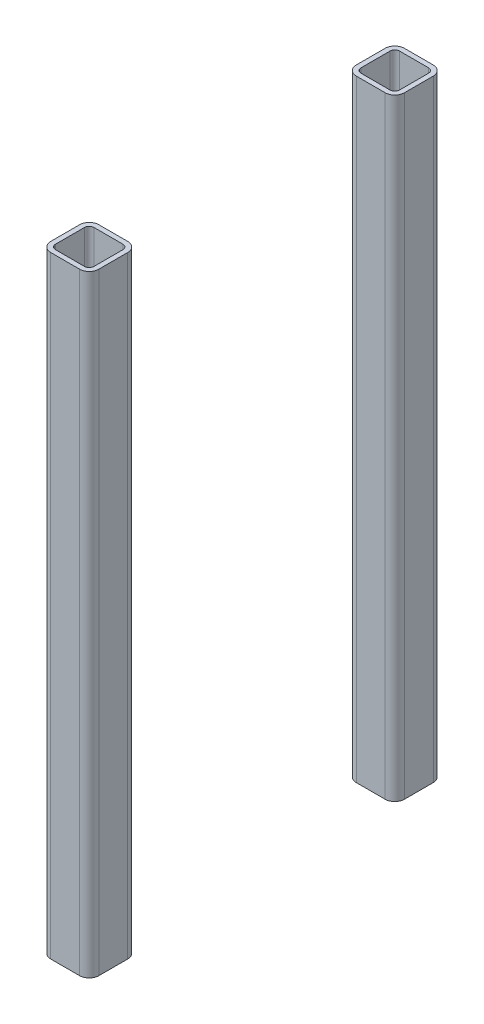
ISO-10303-21;
HEADER;
FILE_DESCRIPTION(('STEP AP214'),'2;1');
FILE_NAME('part.step','',(''),(''),'','','');
FILE_SCHEMA(('AUTOMOTIVE_DESIGN { 1 0 10303 214 1 1 1 1 }'));
ENDSEC;
DATA;
#1=APPLICATION_CONTEXT('core data for automotive mechanical design processes');
#2=APPLICATION_PROTOCOL_DEFINITION('international standard','automotive_design',2000,#1);
#3=PRODUCT_CONTEXT('',#1,'mechanical');
#4=PRODUCT('Part','Part','',(#3));
#5=PRODUCT_RELATED_PRODUCT_CATEGORY('part','',(#4));
#6=PRODUCT_DEFINITION_FORMATION('','',#4);
#7=PRODUCT_DEFINITION_CONTEXT('part definition',#1,'design');
#8=PRODUCT_DEFINITION('design','',#6,#7);
#9=PRODUCT_DEFINITION_SHAPE('','',#8);
#10=(LENGTH_UNIT() NAMED_UNIT(*) SI_UNIT(.MILLI.,.METRE.));
#11=(NAMED_UNIT(*) PLANE_ANGLE_UNIT() SI_UNIT($,.RADIAN.));
#12=(NAMED_UNIT(*) SI_UNIT($,.STERADIAN.) SOLID_ANGLE_UNIT());
#13=UNCERTAINTY_MEASURE_WITH_UNIT(LENGTH_MEASURE(1.E-05),#10,'distance_accuracy_value','');
#14=(GEOMETRIC_REPRESENTATION_CONTEXT(3) GLOBAL_UNCERTAINTY_ASSIGNED_CONTEXT((#13)) GLOBAL_UNIT_ASSIGNED_CONTEXT((#10,
#11,#12)) REPRESENTATION_CONTEXT('',''));
#15=CARTESIAN_POINT('',(0.,0.,0.));
#16=DIRECTION('',(0.,0.,1.));
#17=DIRECTION('',(1.,0.,0.));
#18=AXIS2_PLACEMENT_3D('',#15,#16,#17);
#19=CARTESIAN_POINT('',(12.,-508.61622231298,12.));
#20=DIRECTION('',(0.,1.,0.));
#21=DIRECTION('',(0.,0.,1.));
#22=AXIS2_PLACEMENT_3D('',#19,#20,#21);
#23=CYLINDRICAL_SURFACE('',#22,7.99999999999999);
#24=CARTESIAN_POINT('',(12.,-1.11022302462516E-13,12.));
#25=DIRECTION('',(0.,-1.,0.));
#26=DIRECTION('',(0.,0.,-1.));
#27=AXIS2_PLACEMENT_3D('',#24,#25,#26);
#28=CIRCLE('',#27,7.99999999999999);
#29=CARTESIAN_POINT('',(20.,-1.11022302462516E-13,12.));
#30=VERTEX_POINT('',#29);
#31=CARTESIAN_POINT('',(12.,-1.11022302462516E-13,20.));
#32=VERTEX_POINT('',#31);
#33=EDGE_CURVE('E257',#30,#32,#28,.T.);
#34=ORIENTED_EDGE('',*,*,#33,.T.);
#35=DIRECTION('',(0.,1.,0.));
#36=VECTOR('',#35,1.);
#37=CARTESIAN_POINT('',(12.,-508.61622231298,20.));
#38=LINE('',#37,#36);
#39=CARTESIAN_POINT('',(12.,-508.61622231298,20.));
#40=VERTEX_POINT('',#39);
#41=EDGE_CURVE('E13',#40,#32,#38,.T.);
#42=ORIENTED_EDGE('',*,*,#41,.F.);
#43=CARTESIAN_POINT('',(12.,-508.61622231298,12.));
#44=DIRECTION('',(0.,-1.,0.));
#45=DIRECTION('',(0.,0.,-1.));
#46=AXIS2_PLACEMENT_3D('',#43,#44,#45);
#47=CIRCLE('',#46,7.99999999999999);
#48=CARTESIAN_POINT('',(20.,-508.61622231298,12.));
#49=VERTEX_POINT('',#48);
#50=EDGE_CURVE('E349',#49,#40,#47,.T.);
#51=ORIENTED_EDGE('',*,*,#50,.F.);
#52=DIRECTION('',(0.,1.,0.));
#53=VECTOR('',#52,1.);
#54=CARTESIAN_POINT('',(20.,-508.61622231298,12.));
#55=LINE('',#54,#53);
#56=EDGE_CURVE('E272',#49,#30,#55,.T.);
#57=ORIENTED_EDGE('',*,*,#56,.T.);
#58=EDGE_LOOP('',(#34,#42,#51,#57));
#59=FACE_BOUND('',#58,.T.);
#60=ADVANCED_FACE('F83',(#59),#23,.T.);
#61=CARTESIAN_POINT('',(12.,-508.61622231298,20.));
#62=DIRECTION('',(0.,0.,-1.));
#63=DIRECTION('',(-1.,0.,0.));
#64=AXIS2_PLACEMENT_3D('',#61,#62,#63);
#65=PLANE('',#64);
#66=DIRECTION('',(-1.,0.,0.));
#67=VECTOR('',#66,1.);
#68=CARTESIAN_POINT('',(12.,-1.11022302462516E-13,20.));
#69=LINE('',#68,#67);
#70=CARTESIAN_POINT('',(-12.,-1.11022302462516E-13,20.));
#71=VERTEX_POINT('',#70);
#72=EDGE_CURVE('E260',#32,#71,#69,.T.);
#73=ORIENTED_EDGE('',*,*,#72,.T.);
#74=DIRECTION('',(0.,1.,0.));
#75=VECTOR('',#74,1.);
#76=CARTESIAN_POINT('',(-12.,-508.61622231298,20.));
#77=LINE('',#76,#75);
#78=CARTESIAN_POINT('',(-12.,-508.61622231298,20.));
#79=VERTEX_POINT('',#78);
#80=EDGE_CURVE('E94',#79,#71,#77,.T.);
#81=ORIENTED_EDGE('',*,*,#80,.F.);
#82=DIRECTION('',(-1.,0.,0.));
#83=VECTOR('',#82,1.);
#84=CARTESIAN_POINT('',(12.,-508.61622231298,20.));
#85=LINE('',#84,#83);
#86=EDGE_CURVE('E351',#40,#79,#85,.T.);
#87=ORIENTED_EDGE('',*,*,#86,.F.);
#88=ORIENTED_EDGE('',*,*,#41,.T.);
#89=EDGE_LOOP('',(#73,#81,#87,#88));
#90=FACE_BOUND('',#89,.T.);
#91=ADVANCED_FACE('F386',(#90),#65,.F.);
#92=CARTESIAN_POINT('',(-12.,-508.61622231298,12.));
#93=DIRECTION('',(0.,1.,0.));
#94=DIRECTION('',(0.,0.,1.));
#95=AXIS2_PLACEMENT_3D('',#92,#93,#94);
#96=CYLINDRICAL_SURFACE('',#95,7.99999999999999);
#97=CARTESIAN_POINT('',(-12.,-1.11022302462516E-13,12.));
#98=DIRECTION('',(0.,-1.,0.));
#99=DIRECTION('',(0.,0.,-1.));
#100=AXIS2_PLACEMENT_3D('',#97,#98,#99);
#101=CIRCLE('',#100,7.99999999999999);
#102=CARTESIAN_POINT('',(-20.,-1.11022302462516E-13,12.));
#103=VERTEX_POINT('',#102);
#104=EDGE_CURVE('E262',#71,#103,#101,.T.);
#105=ORIENTED_EDGE('',*,*,#104,.T.);
#106=DIRECTION('',(0.,1.,0.));
#107=VECTOR('',#106,1.);
#108=CARTESIAN_POINT('',(-20.,-508.61622231298,12.));
#109=LINE('',#108,#107);
#110=CARTESIAN_POINT('',(-20.,-508.61622231298,12.));
#111=VERTEX_POINT('',#110);
#112=EDGE_CURVE('E283',#111,#103,#109,.T.);
#113=ORIENTED_EDGE('',*,*,#112,.F.);
#114=CARTESIAN_POINT('',(-12.,-508.61622231298,12.));
#115=DIRECTION('',(0.,-1.,0.));
#116=DIRECTION('',(0.,0.,-1.));
#117=AXIS2_PLACEMENT_3D('',#114,#115,#116);
#118=CIRCLE('',#117,7.99999999999999);
#119=EDGE_CURVE('E353',#79,#111,#118,.T.);
#120=ORIENTED_EDGE('',*,*,#119,.F.);
#121=ORIENTED_EDGE('',*,*,#80,.T.);
#122=EDGE_LOOP('',(#105,#113,#120,#121));
#123=FACE_BOUND('',#122,.T.);
#124=ADVANCED_FACE('F391',(#123),#96,.T.);
#125=CARTESIAN_POINT('',(-20.,-508.61622231298,-12.));
#126=DIRECTION('',(1.,0.,0.));
#127=DIRECTION('',(0.,0.,-1.));
#128=AXIS2_PLACEMENT_3D('',#125,#126,#127);
#129=PLANE('',#128);
#130=DIRECTION('',(0.,0.,-1.));
#131=VECTOR('',#130,1.);
#132=CARTESIAN_POINT('',(-20.,-1.11022302462516E-13,-12.));
#133=LINE('',#132,#131);
#134=CARTESIAN_POINT('',(-20.,-1.11022302462516E-13,-12.));
#135=VERTEX_POINT('',#134);
#136=EDGE_CURVE('E264',#103,#135,#133,.T.);
#137=ORIENTED_EDGE('',*,*,#136,.T.);
#138=DIRECTION('',(0.,1.,0.));
#139=VECTOR('',#138,1.);
#140=CARTESIAN_POINT('',(-20.,-508.61622231298,-12.));
#141=LINE('',#140,#139);
#142=CARTESIAN_POINT('',(-20.,-508.61622231298,-12.));
#143=VERTEX_POINT('',#142);
#144=EDGE_CURVE('E279',#143,#135,#141,.T.);
#145=ORIENTED_EDGE('',*,*,#144,.F.);
#146=DIRECTION('',(0.,0.,-1.));
#147=VECTOR('',#146,1.);
#148=CARTESIAN_POINT('',(-20.,-508.61622231298,-12.));
#149=LINE('',#148,#147);
#150=EDGE_CURVE('E355',#111,#143,#149,.T.);
#151=ORIENTED_EDGE('',*,*,#150,.F.);
#152=ORIENTED_EDGE('',*,*,#112,.T.);
#153=EDGE_LOOP('',(#137,#145,#151,#152));
#154=FACE_BOUND('',#153,.T.);
#155=ADVANCED_FACE('F361',(#154),#129,.F.);
#156=CARTESIAN_POINT('',(-12.,-508.61622231298,-12.));
#157=DIRECTION('',(0.,1.,0.));
#158=DIRECTION('',(0.,0.,1.));
#159=AXIS2_PLACEMENT_3D('',#156,#157,#158);
#160=CYLINDRICAL_SURFACE('',#159,8.);
#161=CARTESIAN_POINT('',(-12.,-1.11022302462516E-13,-12.));
#162=DIRECTION('',(0.,-1.,0.));
#163=DIRECTION('',(0.,0.,-1.));
#164=AXIS2_PLACEMENT_3D('',#161,#162,#163);
#165=CIRCLE('',#164,8.);
#166=CARTESIAN_POINT('',(-12.,-1.11022302462516E-13,-20.));
#167=VERTEX_POINT('',#166);
#168=EDGE_CURVE('E266',#135,#167,#165,.T.);
#169=ORIENTED_EDGE('',*,*,#168,.T.);
#170=DIRECTION('',(0.,1.,0.));
#171=VECTOR('',#170,1.);
#172=CARTESIAN_POINT('',(-12.,-508.61622231298,-20.));
#173=LINE('',#172,#171);
#174=CARTESIAN_POINT('',(-12.,-508.61622231298,-20.));
#175=VERTEX_POINT('',#174);
#176=EDGE_CURVE('E224',#175,#167,#173,.T.);
#177=ORIENTED_EDGE('',*,*,#176,.F.);
#178=CARTESIAN_POINT('',(-12.,-508.61622231298,-12.));
#179=DIRECTION('',(0.,-1.,0.));
#180=DIRECTION('',(0.,0.,-1.));
#181=AXIS2_PLACEMENT_3D('',#178,#179,#180);
#182=CIRCLE('',#181,8.);
#183=EDGE_CURVE('E214',#143,#175,#182,.T.);
#184=ORIENTED_EDGE('',*,*,#183,.F.);
#185=ORIENTED_EDGE('',*,*,#144,.T.);
#186=EDGE_LOOP('',(#169,#177,#184,#185));
#187=FACE_BOUND('',#186,.T.);
#188=ADVANCED_FACE('F365',(#187),#160,.T.);
#189=CARTESIAN_POINT('',(-12.,-508.61622231298,-20.));
#190=DIRECTION('',(0.,0.,1.));
#191=DIRECTION('',(1.,0.,0.));
#192=AXIS2_PLACEMENT_3D('',#189,#190,#191);
#193=PLANE('',#192);
#194=DIRECTION('',(1.,0.,0.));
#195=VECTOR('',#194,1.);
#196=CARTESIAN_POINT('',(-12.,-1.11022302462516E-13,-20.));
#197=LINE('',#196,#195);
#198=CARTESIAN_POINT('',(12.,-1.11022302462516E-13,-20.));
#199=VERTEX_POINT('',#198);
#200=EDGE_CURVE('E222',#167,#199,#197,.T.);
#201=ORIENTED_EDGE('',*,*,#200,.T.);
#202=DIRECTION('',(0.,1.,0.));
#203=VECTOR('',#202,1.);
#204=CARTESIAN_POINT('',(12.,-508.61622231298,-20.));
#205=LINE('',#204,#203);
#206=CARTESIAN_POINT('',(12.,-508.61622231298,-20.));
#207=VERTEX_POINT('',#206);
#208=EDGE_CURVE('E219',#207,#199,#205,.T.);
#209=ORIENTED_EDGE('',*,*,#208,.F.);
#210=DIRECTION('',(1.,0.,0.));
#211=VECTOR('',#210,1.);
#212=CARTESIAN_POINT('',(-12.,-508.61622231298,-20.));
#213=LINE('',#212,#211);
#214=EDGE_CURVE('E208',#175,#207,#213,.T.);
#215=ORIENTED_EDGE('',*,*,#214,.F.);
#216=ORIENTED_EDGE('',*,*,#176,.T.);
#217=EDGE_LOOP('',(#201,#209,#215,#216));
#218=FACE_BOUND('',#217,.T.);
#219=ADVANCED_FACE('F220',(#218),#193,.F.);
#220=CARTESIAN_POINT('',(12.,-508.61622231298,-12.));
#221=DIRECTION('',(0.,1.,0.));
#222=DIRECTION('',(0.,0.,1.));
#223=AXIS2_PLACEMENT_3D('',#220,#221,#222);
#224=CYLINDRICAL_SURFACE('',#223,8.);
#225=CARTESIAN_POINT('',(12.,-1.11022302462516E-13,-12.));
#226=DIRECTION('',(0.,-1.,0.));
#227=DIRECTION('',(0.,0.,-1.));
#228=AXIS2_PLACEMENT_3D('',#225,#226,#227);
#229=CIRCLE('',#228,8.);
#230=CARTESIAN_POINT('',(20.,-1.11022302462516E-13,-12.));
#231=VERTEX_POINT('',#230);
#232=EDGE_CURVE('E156',#199,#231,#229,.T.);
#233=ORIENTED_EDGE('',*,*,#232,.T.);
#234=DIRECTION('',(0.,1.,0.));
#235=VECTOR('',#234,1.);
#236=CARTESIAN_POINT('',(20.,-508.61622231298,-12.));
#237=LINE('',#236,#235);
#238=CARTESIAN_POINT('',(20.,-508.61622231298,-12.));
#239=VERTEX_POINT('',#238);
#240=EDGE_CURVE('E225',#239,#231,#237,.T.);
#241=ORIENTED_EDGE('',*,*,#240,.F.);
#242=CARTESIAN_POINT('',(12.,-508.61622231298,-12.));
#243=DIRECTION('',(0.,-1.,0.));
#244=DIRECTION('',(0.,0.,-1.));
#245=AXIS2_PLACEMENT_3D('',#242,#243,#244);
#246=CIRCLE('',#245,8.);
#247=EDGE_CURVE('E212',#207,#239,#246,.T.);
#248=ORIENTED_EDGE('',*,*,#247,.F.);
#249=ORIENTED_EDGE('',*,*,#208,.T.);
#250=EDGE_LOOP('',(#233,#241,#248,#249));
#251=FACE_BOUND('',#250,.T.);
#252=ADVANCED_FACE('F227',(#251),#224,.T.);
#253=CARTESIAN_POINT('',(-12.,-508.61622231298,12.));
#254=DIRECTION('',(0.,1.,0.));
#255=DIRECTION('',(0.,0.,1.));
#256=AXIS2_PLACEMENT_3D('',#253,#254,#255);
#257=CYLINDRICAL_SURFACE('',#256,3.99999999999999);
#258=CARTESIAN_POINT('',(-12.,-1.11022302462516E-13,12.));
#259=DIRECTION('',(0.,-1.,0.));
#260=DIRECTION('',(0.,0.,-1.));
#261=AXIS2_PLACEMENT_3D('',#258,#259,#260);
#262=CIRCLE('',#261,3.99999999999999);
#263=CARTESIAN_POINT('',(-12.,-1.11022302462516E-13,16.));
#264=VERTEX_POINT('',#263);
#265=CARTESIAN_POINT('',(-16.,-1.11022302462516E-13,12.));
#266=VERTEX_POINT('',#265);
#267=EDGE_CURVE('E233',#264,#266,#262,.T.);
#268=ORIENTED_EDGE('',*,*,#267,.F.);
#269=DIRECTION('',(0.,1.,0.));
#270=VECTOR('',#269,1.);
#271=CARTESIAN_POINT('',(-12.,-508.61622231298,16.));
#272=LINE('',#271,#270);
#273=CARTESIAN_POINT('',(-12.,-508.61622231298,16.));
#274=VERTEX_POINT('',#273);
#275=EDGE_CURVE('E87',#274,#264,#272,.T.);
#276=ORIENTED_EDGE('',*,*,#275,.F.);
#277=CARTESIAN_POINT('',(-12.,-508.61622231298,12.));
#278=DIRECTION('',(0.,-1.,0.));
#279=DIRECTION('',(0.,0.,-1.));
#280=AXIS2_PLACEMENT_3D('',#277,#278,#279);
#281=CIRCLE('',#280,3.99999999999999);
#282=CARTESIAN_POINT('',(-16.,-508.61622231298,12.));
#283=VERTEX_POINT('',#282);
#284=EDGE_CURVE('E271',#274,#283,#281,.T.);
#285=ORIENTED_EDGE('',*,*,#284,.T.);
#286=DIRECTION('',(0.,1.,0.));
#287=VECTOR('',#286,1.);
#288=CARTESIAN_POINT('',(-16.,-508.61622231298,12.));
#289=LINE('',#288,#287);
#290=EDGE_CURVE('E229',#283,#266,#289,.T.);
#291=ORIENTED_EDGE('',*,*,#290,.T.);
#292=EDGE_LOOP('',(#268,#276,#285,#291));
#293=FACE_BOUND('',#292,.T.);
#294=ADVANCED_FACE('F85',(#293),#257,.F.);
#295=CARTESIAN_POINT('',(12.,-508.61622231298,16.));
#296=DIRECTION('',(0.,0.,-1.));
#297=DIRECTION('',(-1.,0.,0.));
#298=AXIS2_PLACEMENT_3D('',#295,#296,#297);
#299=PLANE('',#298);
#300=DIRECTION('',(-1.,0.,0.));
#301=VECTOR('',#300,1.);
#302=CARTESIAN_POINT('',(12.,-1.11022302462516E-13,16.));
#303=LINE('',#302,#301);
#304=CARTESIAN_POINT('',(12.,-1.11022302462516E-13,16.));
#305=VERTEX_POINT('',#304);
#306=EDGE_CURVE('E236',#305,#264,#303,.T.);
#307=ORIENTED_EDGE('',*,*,#306,.F.);
#308=DIRECTION('',(0.,1.,0.));
#309=VECTOR('',#308,1.);
#310=CARTESIAN_POINT('',(12.,-508.61622231298,16.));
#311=LINE('',#310,#309);
#312=CARTESIAN_POINT('',(12.,-508.61622231298,16.));
#313=VERTEX_POINT('',#312);
#314=EDGE_CURVE('E306',#313,#305,#311,.T.);
#315=ORIENTED_EDGE('',*,*,#314,.F.);
#316=DIRECTION('',(-1.,0.,0.));
#317=VECTOR('',#316,1.);
#318=CARTESIAN_POINT('',(12.,-508.61622231298,16.));
#319=LINE('',#318,#317);
#320=EDGE_CURVE('E317',#313,#274,#319,.T.);
#321=ORIENTED_EDGE('',*,*,#320,.T.);
#322=ORIENTED_EDGE('',*,*,#275,.T.);
#323=EDGE_LOOP('',(#307,#315,#321,#322));
#324=FACE_BOUND('',#323,.T.);
#325=ADVANCED_FACE('F315',(#324),#299,.T.);
#326=CARTESIAN_POINT('',(12.,-508.61622231298,12.));
#327=DIRECTION('',(0.,1.,0.));
#328=DIRECTION('',(0.,0.,1.));
#329=AXIS2_PLACEMENT_3D('',#326,#327,#328);
#330=CYLINDRICAL_SURFACE('',#329,3.99999999999999);
#331=CARTESIAN_POINT('',(12.,-1.11022302462516E-13,12.));
#332=DIRECTION('',(0.,-1.,0.));
#333=DIRECTION('',(0.,0.,-1.));
#334=AXIS2_PLACEMENT_3D('',#331,#332,#333);
#335=CIRCLE('',#334,3.99999999999999);
#336=CARTESIAN_POINT('',(16.,-1.11022302462516E-13,12.));
#337=VERTEX_POINT('',#336);
#338=EDGE_CURVE('E239',#337,#305,#335,.T.);
#339=ORIENTED_EDGE('',*,*,#338,.F.);
#340=DIRECTION('',(0.,1.,0.));
#341=VECTOR('',#340,1.);
#342=CARTESIAN_POINT('',(16.,-508.61622231298,12.));
#343=LINE('',#342,#341);
#344=CARTESIAN_POINT('',(16.,-508.61622231298,12.));
#345=VERTEX_POINT('',#344);
#346=EDGE_CURVE('E304',#345,#337,#343,.T.);
#347=ORIENTED_EDGE('',*,*,#346,.F.);
#348=CARTESIAN_POINT('',(12.,-508.61622231298,12.));
#349=DIRECTION('',(0.,-1.,0.));
#350=DIRECTION('',(0.,0.,-1.));
#351=AXIS2_PLACEMENT_3D('',#348,#349,#350);
#352=CIRCLE('',#351,3.99999999999999);
#353=EDGE_CURVE('E325',#345,#313,#352,.T.);
#354=ORIENTED_EDGE('',*,*,#353,.T.);
#355=ORIENTED_EDGE('',*,*,#314,.T.);
#356=EDGE_LOOP('',(#339,#347,#354,#355));
#357=FACE_BOUND('',#356,.T.);
#358=ADVANCED_FACE('F323',(#357),#330,.F.);
#359=CARTESIAN_POINT('',(16.,-508.61622231298,12.));
#360=DIRECTION('',(-1.,0.,0.));
#361=DIRECTION('',(0.,0.,1.));
#362=AXIS2_PLACEMENT_3D('',#359,#360,#361);
#363=PLANE('',#362);
#364=DIRECTION('',(0.,0.,1.));
#365=VECTOR('',#364,1.);
#366=CARTESIAN_POINT('',(16.,-1.11022302462516E-13,12.));
#367=LINE('',#366,#365);
#368=CARTESIAN_POINT('',(16.,-1.11022302462516E-13,-12.));
#369=VERTEX_POINT('',#368);
#370=EDGE_CURVE('E242',#369,#337,#367,.T.);
#371=ORIENTED_EDGE('',*,*,#370,.F.);
#372=DIRECTION('',(0.,1.,0.));
#373=VECTOR('',#372,1.);
#374=CARTESIAN_POINT('',(16.,-508.61622231298,-12.));
#375=LINE('',#374,#373);
#376=CARTESIAN_POINT('',(16.,-508.61622231298,-12.));
#377=VERTEX_POINT('',#376);
#378=EDGE_CURVE('E301',#377,#369,#375,.T.);
#379=ORIENTED_EDGE('',*,*,#378,.F.);
#380=DIRECTION('',(0.,0.,1.));
#381=VECTOR('',#380,1.);
#382=CARTESIAN_POINT('',(16.,-508.61622231298,12.));
#383=LINE('',#382,#381);
#384=EDGE_CURVE('E331',#377,#345,#383,.T.);
#385=ORIENTED_EDGE('',*,*,#384,.T.);
#386=ORIENTED_EDGE('',*,*,#346,.T.);
#387=EDGE_LOOP('',(#371,#379,#385,#386));
#388=FACE_BOUND('',#387,.T.);
#389=ADVANCED_FACE('F334',(#388),#363,.T.);
#390=CARTESIAN_POINT('',(12.,-508.61622231298,-12.));
#391=DIRECTION('',(0.,1.,0.));
#392=DIRECTION('',(0.,0.,1.));
#393=AXIS2_PLACEMENT_3D('',#390,#391,#392);
#394=CYLINDRICAL_SURFACE('',#393,4.);
#395=CARTESIAN_POINT('',(12.,-1.11022302462516E-13,-12.));
#396=DIRECTION('',(0.,-1.,0.));
#397=DIRECTION('',(0.,0.,-1.));
#398=AXIS2_PLACEMENT_3D('',#395,#396,#397);
#399=CIRCLE('',#398,4.);
#400=CARTESIAN_POINT('',(12.,-1.11022302462516E-13,-16.));
#401=VERTEX_POINT('',#400);
#402=EDGE_CURVE('E245',#401,#369,#399,.T.);
#403=ORIENTED_EDGE('',*,*,#402,.F.);
#404=DIRECTION('',(0.,1.,0.));
#405=VECTOR('',#404,1.);
#406=CARTESIAN_POINT('',(12.,-508.61622231298,-16.));
#407=LINE('',#406,#405);
#408=CARTESIAN_POINT('',(12.,-508.61622231298,-16.));
#409=VERTEX_POINT('',#408);
#410=EDGE_CURVE('E298',#409,#401,#407,.T.);
#411=ORIENTED_EDGE('',*,*,#410,.F.);
#412=CARTESIAN_POINT('',(12.,-508.61622231298,-12.));
#413=DIRECTION('',(0.,-1.,0.));
#414=DIRECTION('',(0.,0.,-1.));
#415=AXIS2_PLACEMENT_3D('',#412,#413,#414);
#416=CIRCLE('',#415,4.);
#417=EDGE_CURVE('E335',#409,#377,#416,.T.);
#418=ORIENTED_EDGE('',*,*,#417,.T.);
#419=ORIENTED_EDGE('',*,*,#378,.T.);
#420=EDGE_LOOP('',(#403,#411,#418,#419));
#421=FACE_BOUND('',#420,.T.);
#422=ADVANCED_FACE('F402',(#421),#394,.F.);
#423=CARTESIAN_POINT('',(-12.,-508.61622231298,-16.));
#424=DIRECTION('',(0.,0.,1.));
#425=DIRECTION('',(1.,0.,0.));
#426=AXIS2_PLACEMENT_3D('',#423,#424,#425);
#427=PLANE('',#426);
#428=DIRECTION('',(1.,0.,0.));
#429=VECTOR('',#428,1.);
#430=CARTESIAN_POINT('',(-12.,-1.11022302462516E-13,-16.));
#431=LINE('',#430,#429);
#432=CARTESIAN_POINT('',(-12.,-1.11022302462516E-13,-16.));
#433=VERTEX_POINT('',#432);
#434=EDGE_CURVE('E248',#433,#401,#431,.T.);
#435=ORIENTED_EDGE('',*,*,#434,.F.);
#436=DIRECTION('',(0.,1.,0.));
#437=VECTOR('',#436,1.);
#438=CARTESIAN_POINT('',(-12.,-508.61622231298,-16.));
#439=LINE('',#438,#437);
#440=CARTESIAN_POINT('',(-12.,-508.61622231298,-16.));
#441=VERTEX_POINT('',#440);
#442=EDGE_CURVE('E295',#441,#433,#439,.T.);
#443=ORIENTED_EDGE('',*,*,#442,.F.);
#444=DIRECTION('',(1.,0.,0.));
#445=VECTOR('',#444,1.);
#446=CARTESIAN_POINT('',(-12.,-508.61622231298,-16.));
#447=LINE('',#446,#445);
#448=EDGE_CURVE('E337',#441,#409,#447,.T.);
#449=ORIENTED_EDGE('',*,*,#448,.T.);
#450=ORIENTED_EDGE('',*,*,#410,.T.);
#451=EDGE_LOOP('',(#435,#443,#449,#450));
#452=FACE_BOUND('',#451,.T.);
#453=ADVANCED_FACE('F398',(#452),#427,.T.);
#454=CARTESIAN_POINT('',(-12.,-508.61622231298,-12.));
#455=DIRECTION('',(0.,1.,0.));
#456=DIRECTION('',(0.,0.,1.));
#457=AXIS2_PLACEMENT_3D('',#454,#455,#456);
#458=CYLINDRICAL_SURFACE('',#457,4.);
#459=CARTESIAN_POINT('',(-12.,-1.11022302462516E-13,-12.));
#460=DIRECTION('',(0.,-1.,0.));
#461=DIRECTION('',(0.,0.,-1.));
#462=AXIS2_PLACEMENT_3D('',#459,#460,#461);
#463=CIRCLE('',#462,4.);
#464=CARTESIAN_POINT('',(-16.,-1.11022302462516E-13,-12.));
#465=VERTEX_POINT('',#464);
#466=EDGE_CURVE('E251',#465,#433,#463,.T.);
#467=ORIENTED_EDGE('',*,*,#466,.F.);
#468=DIRECTION('',(0.,1.,0.));
#469=VECTOR('',#468,1.);
#470=CARTESIAN_POINT('',(-16.,-508.61622231298,-12.));
#471=LINE('',#470,#469);
#472=CARTESIAN_POINT('',(-16.,-508.61622231298,-12.));
#473=VERTEX_POINT('',#472);
#474=EDGE_CURVE('E292',#473,#465,#471,.T.);
#475=ORIENTED_EDGE('',*,*,#474,.F.);
#476=CARTESIAN_POINT('',(-12.,-508.61622231298,-12.));
#477=DIRECTION('',(0.,-1.,0.));
#478=DIRECTION('',(0.,0.,-1.));
#479=AXIS2_PLACEMENT_3D('',#476,#477,#478);
#480=CIRCLE('',#479,4.);
#481=EDGE_CURVE('E343',#473,#441,#480,.T.);
#482=ORIENTED_EDGE('',*,*,#481,.T.);
#483=ORIENTED_EDGE('',*,*,#442,.T.);
#484=EDGE_LOOP('',(#467,#475,#482,#483));
#485=FACE_BOUND('',#484,.T.);
#486=ADVANCED_FACE('F380',(#485),#458,.F.);
#487=CARTESIAN_POINT('',(-16.,-508.61622231298,-12.));
#488=DIRECTION('',(1.,0.,0.));
#489=DIRECTION('',(0.,0.,-1.));
#490=AXIS2_PLACEMENT_3D('',#487,#488,#489);
#491=PLANE('',#490);
#492=DIRECTION('',(0.,0.,-1.));
#493=VECTOR('',#492,1.);
#494=CARTESIAN_POINT('',(-16.,-1.11022302462516E-13,-12.));
#495=LINE('',#494,#493);
#496=EDGE_CURVE('E254',#266,#465,#495,.T.);
#497=ORIENTED_EDGE('',*,*,#496,.F.);
#498=ORIENTED_EDGE('',*,*,#290,.F.);
#499=DIRECTION('',(0.,0.,-1.));
#500=VECTOR('',#499,1.);
#501=CARTESIAN_POINT('',(-16.,-508.61622231298,-12.));
#502=LINE('',#501,#500);
#503=EDGE_CURVE('E346',#283,#473,#502,.T.);
#504=ORIENTED_EDGE('',*,*,#503,.T.);
#505=ORIENTED_EDGE('',*,*,#474,.T.);
#506=EDGE_LOOP('',(#497,#498,#504,#505));
#507=FACE_BOUND('',#506,.T.);
#508=ADVANCED_FACE('F373',(#507),#491,.T.);
#509=CARTESIAN_POINT('',(20.,-508.61622231298,12.));
#510=DIRECTION('',(-1.,0.,0.));
#511=DIRECTION('',(0.,0.,1.));
#512=AXIS2_PLACEMENT_3D('',#509,#510,#511);
#513=PLANE('',#512);
#514=DIRECTION('',(0.,0.,1.));
#515=VECTOR('',#514,1.);
#516=CARTESIAN_POINT('',(20.,-1.11022302462516E-13,12.));
#517=LINE('',#516,#515);
#518=EDGE_CURVE('E162',#231,#30,#517,.T.);
#519=ORIENTED_EDGE('',*,*,#518,.T.);
#520=ORIENTED_EDGE('',*,*,#56,.F.);
#521=DIRECTION('',(0.,0.,1.));
#522=VECTOR('',#521,1.);
#523=CARTESIAN_POINT('',(20.,-508.61622231298,12.));
#524=LINE('',#523,#522);
#525=EDGE_CURVE('E103',#239,#49,#524,.T.);
#526=ORIENTED_EDGE('',*,*,#525,.F.);
#527=ORIENTED_EDGE('',*,*,#240,.T.);
#528=EDGE_LOOP('',(#519,#520,#526,#527));
#529=FACE_BOUND('',#528,.T.);
#530=ADVANCED_FACE('F371',(#529),#513,.F.);
#531=CARTESIAN_POINT('',(12.,-508.61622231298,12.));
#532=DIRECTION('',(0.,-1.,0.));
#533=DIRECTION('',(0.,0.,-1.));
#534=AXIS2_PLACEMENT_3D('',#531,#532,#533);
#535=PLANE('',#534);
#536=ORIENTED_EDGE('',*,*,#284,.F.);
#537=ORIENTED_EDGE('',*,*,#320,.F.);
#538=ORIENTED_EDGE('',*,*,#353,.F.);
#539=ORIENTED_EDGE('',*,*,#384,.F.);
#540=ORIENTED_EDGE('',*,*,#417,.F.);
#541=ORIENTED_EDGE('',*,*,#448,.F.);
#542=ORIENTED_EDGE('',*,*,#481,.F.);
#543=ORIENTED_EDGE('',*,*,#503,.F.);
#544=EDGE_LOOP('',(#536,#537,#538,#539,#540,#541,#542,#543));
#545=FACE_BOUND('',#544,.T.);
#546=ORIENTED_EDGE('',*,*,#50,.T.);
#547=ORIENTED_EDGE('',*,*,#86,.T.);
#548=ORIENTED_EDGE('',*,*,#119,.T.);
#549=ORIENTED_EDGE('',*,*,#150,.T.);
#550=ORIENTED_EDGE('',*,*,#183,.T.);
#551=ORIENTED_EDGE('',*,*,#214,.T.);
#552=ORIENTED_EDGE('',*,*,#247,.T.);
#553=ORIENTED_EDGE('',*,*,#525,.T.);
#554=EDGE_LOOP('',(#546,#547,#548,#549,#550,#551,#552,#553));
#555=FACE_BOUND('',#554,.T.);
#556=ADVANCED_FACE('F210',(#545,#555),#535,.T.);
#557=CARTESIAN_POINT('',(12.,-1.11022302462516E-13,12.));
#558=DIRECTION('',(0.,-1.,0.));
#559=DIRECTION('',(0.,0.,-1.));
#560=AXIS2_PLACEMENT_3D('',#557,#558,#559);
#561=PLANE('',#560);
#562=ORIENTED_EDGE('',*,*,#267,.T.);
#563=ORIENTED_EDGE('',*,*,#496,.T.);
#564=ORIENTED_EDGE('',*,*,#466,.T.);
#565=ORIENTED_EDGE('',*,*,#434,.T.);
#566=ORIENTED_EDGE('',*,*,#402,.T.);
#567=ORIENTED_EDGE('',*,*,#370,.T.);
#568=ORIENTED_EDGE('',*,*,#338,.T.);
#569=ORIENTED_EDGE('',*,*,#306,.T.);
#570=EDGE_LOOP('',(#562,#563,#564,#565,#566,#567,#568,#569));
#571=FACE_BOUND('',#570,.T.);
#572=ORIENTED_EDGE('',*,*,#33,.F.);
#573=ORIENTED_EDGE('',*,*,#518,.F.);
#574=ORIENTED_EDGE('',*,*,#232,.F.);
#575=ORIENTED_EDGE('',*,*,#200,.F.);
#576=ORIENTED_EDGE('',*,*,#168,.F.);
#577=ORIENTED_EDGE('',*,*,#136,.F.);
#578=ORIENTED_EDGE('',*,*,#104,.F.);
#579=ORIENTED_EDGE('',*,*,#72,.F.);
#580=EDGE_LOOP('',(#572,#573,#574,#575,#576,#577,#578,#579));
#581=FACE_BOUND('',#580,.T.);
#582=ADVANCED_FACE('F320',(#571,#581),#561,.F.);
#583=CLOSED_SHELL('',(#60,#91,#124,#155,#188,#219,#252,#294,#325,#358,#389,#422,#453,#486,#508,
#530,#556,#582));
#584=MANIFOLD_SOLID_BREP('B2',#583);
#585=CARTESIAN_POINT('',(12.,-508.61622231298,-242.));
#586=DIRECTION('',(0.,1.,0.));
#587=DIRECTION('',(0.,0.,1.));
#588=AXIS2_PLACEMENT_3D('',#585,#586,#587);
#589=CYLINDRICAL_SURFACE('',#588,7.99999999999999);
#590=CARTESIAN_POINT('',(12.,-1.11022302462516E-13,-242.));
#591=DIRECTION('',(0.,-1.,0.));
#592=DIRECTION('',(0.,0.,-1.));
#593=AXIS2_PLACEMENT_3D('',#590,#591,#592);
#594=CIRCLE('',#593,7.99999999999999);
#595=CARTESIAN_POINT('',(20.,-1.11022302462516E-13,-242.));
#596=VERTEX_POINT('',#595);
#597=CARTESIAN_POINT('',(12.,-1.11022302462516E-13,-234.));
#598=VERTEX_POINT('',#597);
#599=EDGE_CURVE('E785',#596,#598,#594,.T.);
#600=ORIENTED_EDGE('',*,*,#599,.T.);
#601=DIRECTION('',(0.,1.,0.));
#602=VECTOR('',#601,1.);
#603=CARTESIAN_POINT('',(12.,-508.61622231298,-234.));
#604=LINE('',#603,#602);
#605=CARTESIAN_POINT('',(12.,-508.61622231298,-234.));
#606=VERTEX_POINT('',#605);
#607=EDGE_CURVE('E81',#606,#598,#604,.T.);
#608=ORIENTED_EDGE('',*,*,#607,.F.);
#609=CARTESIAN_POINT('',(12.,-508.61622231298,-242.));
#610=DIRECTION('',(0.,-1.,0.));
#611=DIRECTION('',(0.,0.,-1.));
#612=AXIS2_PLACEMENT_3D('',#609,#610,#611);
#613=CIRCLE('',#612,7.99999999999999);
#614=CARTESIAN_POINT('',(20.,-508.61622231298,-242.));
#615=VERTEX_POINT('',#614);
#616=EDGE_CURVE('E863',#615,#606,#613,.T.);
#617=ORIENTED_EDGE('',*,*,#616,.F.);
#618=DIRECTION('',(0.,1.,0.));
#619=VECTOR('',#618,1.);
#620=CARTESIAN_POINT('',(20.,-508.61622231298,-242.));
#621=LINE('',#620,#619);
#622=EDGE_CURVE('E800',#615,#596,#621,.T.);
#623=ORIENTED_EDGE('',*,*,#622,.T.);
#624=EDGE_LOOP('',(#600,#608,#617,#623));
#625=FACE_BOUND('',#624,.T.);
#626=ADVANCED_FACE('F613',(#625),#589,.T.);
#627=CARTESIAN_POINT('',(12.,-508.61622231298,-234.));
#628=DIRECTION('',(0.,0.,-1.));
#629=DIRECTION('',(-1.,0.,0.));
#630=AXIS2_PLACEMENT_3D('',#627,#628,#629);
#631=PLANE('',#630);
#632=DIRECTION('',(-1.,0.,0.));
#633=VECTOR('',#632,1.);
#634=CARTESIAN_POINT('',(12.,-1.11022302462516E-13,-234.));
#635=LINE('',#634,#633);
#636=CARTESIAN_POINT('',(-12.,-1.11022302462516E-13,-234.));
#637=VERTEX_POINT('',#636);
#638=EDGE_CURVE('E788',#598,#637,#635,.T.);
#639=ORIENTED_EDGE('',*,*,#638,.T.);
#640=DIRECTION('',(0.,1.,0.));
#641=VECTOR('',#640,1.);
#642=CARTESIAN_POINT('',(-12.,-508.61622231298,-234.));
#643=LINE('',#642,#641);
#644=CARTESIAN_POINT('',(-12.,-508.61622231298,-234.));
#645=VERTEX_POINT('',#644);
#646=EDGE_CURVE('E623',#645,#637,#643,.T.);
#647=ORIENTED_EDGE('',*,*,#646,.F.);
#648=DIRECTION('',(-1.,0.,0.));
#649=VECTOR('',#648,1.);
#650=CARTESIAN_POINT('',(12.,-508.61622231298,-234.));
#651=LINE('',#650,#649);
#652=EDGE_CURVE('E865',#606,#645,#651,.T.);
#653=ORIENTED_EDGE('',*,*,#652,.F.);
#654=ORIENTED_EDGE('',*,*,#607,.T.);
#655=EDGE_LOOP('',(#639,#647,#653,#654));
#656=FACE_BOUND('',#655,.T.);
#657=ADVANCED_FACE('F900',(#656),#631,.F.);
#658=CARTESIAN_POINT('',(-12.,-508.61622231298,-242.));
#659=DIRECTION('',(0.,1.,0.));
#660=DIRECTION('',(0.,0.,1.));
#661=AXIS2_PLACEMENT_3D('',#658,#659,#660);
#662=CYLINDRICAL_SURFACE('',#661,7.99999999999999);
#663=CARTESIAN_POINT('',(-12.,-1.11022302462516E-13,-242.));
#664=DIRECTION('',(0.,-1.,0.));
#665=DIRECTION('',(0.,0.,-1.));
#666=AXIS2_PLACEMENT_3D('',#663,#664,#665);
#667=CIRCLE('',#666,7.99999999999999);
#668=CARTESIAN_POINT('',(-20.,-1.11022302462516E-13,-242.));
#669=VERTEX_POINT('',#668);
#670=EDGE_CURVE('E790',#637,#669,#667,.T.);
#671=ORIENTED_EDGE('',*,*,#670,.T.);
#672=DIRECTION('',(0.,1.,0.));
#673=VECTOR('',#672,1.);
#674=CARTESIAN_POINT('',(-20.,-508.61622231298,-242.));
#675=LINE('',#674,#673);
#676=CARTESIAN_POINT('',(-20.,-508.61622231298,-242.));
#677=VERTEX_POINT('',#676);
#678=EDGE_CURVE('E807',#677,#669,#675,.T.);
#679=ORIENTED_EDGE('',*,*,#678,.F.);
#680=CARTESIAN_POINT('',(-12.,-508.61622231298,-242.));
#681=DIRECTION('',(0.,-1.,0.));
#682=DIRECTION('',(0.,0.,-1.));
#683=AXIS2_PLACEMENT_3D('',#680,#681,#682);
#684=CIRCLE('',#683,7.99999999999999);
#685=EDGE_CURVE('E867',#645,#677,#684,.T.);
#686=ORIENTED_EDGE('',*,*,#685,.F.);
#687=ORIENTED_EDGE('',*,*,#646,.T.);
#688=EDGE_LOOP('',(#671,#679,#686,#687));
#689=FACE_BOUND('',#688,.T.);
#690=ADVANCED_FACE('F905',(#689),#662,.T.);
#691=CARTESIAN_POINT('',(-20.,-508.61622231298,-266.));
#692=DIRECTION('',(1.,0.,0.));
#693=DIRECTION('',(0.,0.,-1.));
#694=AXIS2_PLACEMENT_3D('',#691,#692,#693);
#695=PLANE('',#694);
#696=DIRECTION('',(0.,0.,-1.));
#697=VECTOR('',#696,1.);
#698=CARTESIAN_POINT('',(-20.,-1.11022302462516E-13,-266.));
#699=LINE('',#698,#697);
#700=CARTESIAN_POINT('',(-20.,-1.11022302462516E-13,-266.));
#701=VERTEX_POINT('',#700);
#702=EDGE_CURVE('E792',#669,#701,#699,.T.);
#703=ORIENTED_EDGE('',*,*,#702,.T.);
#704=DIRECTION('',(0.,1.,0.));
#705=VECTOR('',#704,1.);
#706=CARTESIAN_POINT('',(-20.,-508.61622231298,-266.));
#707=LINE('',#706,#705);
#708=CARTESIAN_POINT('',(-20.,-508.61622231298,-266.));
#709=VERTEX_POINT('',#708);
#710=EDGE_CURVE('E804',#709,#701,#707,.T.);
#711=ORIENTED_EDGE('',*,*,#710,.F.);
#712=DIRECTION('',(0.,0.,-1.));
#713=VECTOR('',#712,1.);
#714=CARTESIAN_POINT('',(-20.,-508.61622231298,-266.));
#715=LINE('',#714,#713);
#716=EDGE_CURVE('E869',#677,#709,#715,.T.);
#717=ORIENTED_EDGE('',*,*,#716,.F.);
#718=ORIENTED_EDGE('',*,*,#678,.T.);
#719=EDGE_LOOP('',(#703,#711,#717,#718));
#720=FACE_BOUND('',#719,.T.);
#721=ADVANCED_FACE('F875',(#720),#695,.F.);
#722=CARTESIAN_POINT('',(-12.,-508.61622231298,-266.));
#723=DIRECTION('',(0.,1.,0.));
#724=DIRECTION('',(0.,0.,1.));
#725=AXIS2_PLACEMENT_3D('',#722,#723,#724);
#726=CYLINDRICAL_SURFACE('',#725,8.);
#727=CARTESIAN_POINT('',(-12.,-1.11022302462516E-13,-266.));
#728=DIRECTION('',(0.,-1.,0.));
#729=DIRECTION('',(0.,0.,-1.));
#730=AXIS2_PLACEMENT_3D('',#727,#728,#729);
#731=CIRCLE('',#730,8.);
#732=CARTESIAN_POINT('',(-12.,-1.11022302462516E-13,-274.));
#733=VERTEX_POINT('',#732);
#734=EDGE_CURVE('E794',#701,#733,#731,.T.);
#735=ORIENTED_EDGE('',*,*,#734,.T.);
#736=DIRECTION('',(0.,1.,0.));
#737=VECTOR('',#736,1.);
#738=CARTESIAN_POINT('',(-12.,-508.61622231298,-274.));
#739=LINE('',#738,#737);
#740=CARTESIAN_POINT('',(-12.,-508.61622231298,-274.));
#741=VERTEX_POINT('',#740);
#742=EDGE_CURVE('E752',#741,#733,#739,.T.);
#743=ORIENTED_EDGE('',*,*,#742,.F.);
#744=CARTESIAN_POINT('',(-12.,-508.61622231298,-266.));
#745=DIRECTION('',(0.,-1.,0.));
#746=DIRECTION('',(0.,0.,-1.));
#747=AXIS2_PLACEMENT_3D('',#744,#745,#746);
#748=CIRCLE('',#747,8.);
#749=EDGE_CURVE('E743',#709,#741,#748,.T.);
#750=ORIENTED_EDGE('',*,*,#749,.F.);
#751=ORIENTED_EDGE('',*,*,#710,.T.);
#752=EDGE_LOOP('',(#735,#743,#750,#751));
#753=FACE_BOUND('',#752,.T.);
#754=ADVANCED_FACE('F879',(#753),#726,.T.);
#755=CARTESIAN_POINT('',(-12.,-508.61622231298,-274.));
#756=DIRECTION('',(0.,0.,1.));
#757=DIRECTION('',(1.,0.,0.));
#758=AXIS2_PLACEMENT_3D('',#755,#756,#757);
#759=PLANE('',#758);
#760=DIRECTION('',(1.,0.,0.));
#761=VECTOR('',#760,1.);
#762=CARTESIAN_POINT('',(-12.,-1.11022302462516E-13,-274.));
#763=LINE('',#762,#761);
#764=CARTESIAN_POINT('',(12.,-1.11022302462516E-13,-274.));
#765=VERTEX_POINT('',#764);
#766=EDGE_CURVE('E751',#733,#765,#763,.T.);
#767=ORIENTED_EDGE('',*,*,#766,.T.);
#768=DIRECTION('',(0.,1.,0.));
#769=VECTOR('',#768,1.);
#770=CARTESIAN_POINT('',(12.,-508.61622231298,-274.));
#771=LINE('',#770,#769);
#772=CARTESIAN_POINT('',(12.,-508.61622231298,-274.));
#773=VERTEX_POINT('',#772);
#774=EDGE_CURVE('E748',#773,#765,#771,.T.);
#775=ORIENTED_EDGE('',*,*,#774,.F.);
#776=DIRECTION('',(1.,0.,0.));
#777=VECTOR('',#776,1.);
#778=CARTESIAN_POINT('',(-12.,-508.61622231298,-274.));
#779=LINE('',#778,#777);
#780=EDGE_CURVE('E737',#741,#773,#779,.T.);
#781=ORIENTED_EDGE('',*,*,#780,.F.);
#782=ORIENTED_EDGE('',*,*,#742,.T.);
#783=EDGE_LOOP('',(#767,#775,#781,#782));
#784=FACE_BOUND('',#783,.T.);
#785=ADVANCED_FACE('F749',(#784),#759,.F.);
#786=CARTESIAN_POINT('',(12.,-508.61622231298,-266.));
#787=DIRECTION('',(0.,1.,0.));
#788=DIRECTION('',(0.,0.,1.));
#789=AXIS2_PLACEMENT_3D('',#786,#787,#788);
#790=CYLINDRICAL_SURFACE('',#789,8.);
#791=CARTESIAN_POINT('',(12.,-1.11022302462516E-13,-266.));
#792=DIRECTION('',(0.,-1.,0.));
#793=DIRECTION('',(0.,0.,-1.));
#794=AXIS2_PLACEMENT_3D('',#791,#792,#793);
#795=CIRCLE('',#794,8.);
#796=CARTESIAN_POINT('',(20.,-1.11022302462516E-13,-266.));
#797=VERTEX_POINT('',#796);
#798=EDGE_CURVE('E685',#765,#797,#795,.T.);
#799=ORIENTED_EDGE('',*,*,#798,.T.);
#800=DIRECTION('',(0.,1.,0.));
#801=VECTOR('',#800,1.);
#802=CARTESIAN_POINT('',(20.,-508.61622231298,-266.));
#803=LINE('',#802,#801);
#804=CARTESIAN_POINT('',(20.,-508.61622231298,-266.));
#805=VERTEX_POINT('',#804);
#806=EDGE_CURVE('E753',#805,#797,#803,.T.);
#807=ORIENTED_EDGE('',*,*,#806,.F.);
#808=CARTESIAN_POINT('',(12.,-508.61622231298,-266.));
#809=DIRECTION('',(0.,-1.,0.));
#810=DIRECTION('',(0.,0.,-1.));
#811=AXIS2_PLACEMENT_3D('',#808,#809,#810);
#812=CIRCLE('',#811,8.);
#813=EDGE_CURVE('E741',#773,#805,#812,.T.);
#814=ORIENTED_EDGE('',*,*,#813,.F.);
#815=ORIENTED_EDGE('',*,*,#774,.T.);
#816=EDGE_LOOP('',(#799,#807,#814,#815));
#817=FACE_BOUND('',#816,.T.);
#818=ADVANCED_FACE('F755',(#817),#790,.T.);
#819=CARTESIAN_POINT('',(-12.,-508.61622231298,-242.));
#820=DIRECTION('',(0.,1.,0.));
#821=DIRECTION('',(0.,0.,1.));
#822=AXIS2_PLACEMENT_3D('',#819,#820,#821);
#823=CYLINDRICAL_SURFACE('',#822,3.99999999999999);
#824=CARTESIAN_POINT('',(-12.,-1.11022302462516E-13,-242.));
#825=DIRECTION('',(0.,-1.,0.));
#826=DIRECTION('',(0.,0.,-1.));
#827=AXIS2_PLACEMENT_3D('',#824,#825,#826);
#828=CIRCLE('',#827,3.99999999999999);
#829=CARTESIAN_POINT('',(-12.,-1.11022302462516E-13,-238.));
#830=VERTEX_POINT('',#829);
#831=CARTESIAN_POINT('',(-16.,-1.11022302462516E-13,-242.));
#832=VERTEX_POINT('',#831);
#833=EDGE_CURVE('E761',#830,#832,#828,.T.);
#834=ORIENTED_EDGE('',*,*,#833,.F.);
#835=DIRECTION('',(0.,1.,0.));
#836=VECTOR('',#835,1.);
#837=CARTESIAN_POINT('',(-12.,-508.61622231298,-238.));
#838=LINE('',#837,#836);
#839=CARTESIAN_POINT('',(-12.,-508.61622231298,-238.));
#840=VERTEX_POINT('',#839);
#841=EDGE_CURVE('E617',#840,#830,#838,.T.);
#842=ORIENTED_EDGE('',*,*,#841,.F.);
#843=CARTESIAN_POINT('',(-12.,-508.61622231298,-242.));
#844=DIRECTION('',(0.,-1.,0.));
#845=DIRECTION('',(0.,0.,-1.));
#846=AXIS2_PLACEMENT_3D('',#843,#844,#845);
#847=CIRCLE('',#846,3.99999999999999);
#848=CARTESIAN_POINT('',(-16.,-508.61622231298,-242.));
#849=VERTEX_POINT('',#848);
#850=EDGE_CURVE('E799',#840,#849,#847,.T.);
#851=ORIENTED_EDGE('',*,*,#850,.T.);
#852=DIRECTION('',(0.,1.,0.));
#853=VECTOR('',#852,1.);
#854=CARTESIAN_POINT('',(-16.,-508.61622231298,-242.));
#855=LINE('',#854,#853);
#856=EDGE_CURVE('E757',#849,#832,#855,.T.);
#857=ORIENTED_EDGE('',*,*,#856,.T.);
#858=EDGE_LOOP('',(#834,#842,#851,#857));
#859=FACE_BOUND('',#858,.T.);
#860=ADVANCED_FACE('F615',(#859),#823,.F.);
#861=CARTESIAN_POINT('',(12.,-508.61622231298,-238.));
#862=DIRECTION('',(0.,0.,-1.));
#863=DIRECTION('',(-1.,0.,0.));
#864=AXIS2_PLACEMENT_3D('',#861,#862,#863);
#865=PLANE('',#864);
#866=DIRECTION('',(-1.,0.,0.));
#867=VECTOR('',#866,1.);
#868=CARTESIAN_POINT('',(12.,-1.11022302462516E-13,-238.));
#869=LINE('',#868,#867);
#870=CARTESIAN_POINT('',(12.,-1.11022302462516E-13,-238.));
#871=VERTEX_POINT('',#870);
#872=EDGE_CURVE('E764',#871,#830,#869,.T.);
#873=ORIENTED_EDGE('',*,*,#872,.F.);
#874=DIRECTION('',(0.,1.,0.));
#875=VECTOR('',#874,1.);
#876=CARTESIAN_POINT('',(12.,-508.61622231298,-238.));
#877=LINE('',#876,#875);
#878=CARTESIAN_POINT('',(12.,-508.61622231298,-238.));
#879=VERTEX_POINT('',#878);
#880=EDGE_CURVE('E822',#879,#871,#877,.T.);
#881=ORIENTED_EDGE('',*,*,#880,.F.);
#882=DIRECTION('',(-1.,0.,0.));
#883=VECTOR('',#882,1.);
#884=CARTESIAN_POINT('',(12.,-508.61622231298,-238.));
#885=LINE('',#884,#883);
#886=EDGE_CURVE('E831',#879,#840,#885,.T.);
#887=ORIENTED_EDGE('',*,*,#886,.T.);
#888=ORIENTED_EDGE('',*,*,#841,.T.);
#889=EDGE_LOOP('',(#873,#881,#887,#888));
#890=FACE_BOUND('',#889,.T.);
#891=ADVANCED_FACE('F829',(#890),#865,.T.);
#892=CARTESIAN_POINT('',(12.,-508.61622231298,-242.));
#893=DIRECTION('',(0.,1.,0.));
#894=DIRECTION('',(0.,0.,1.));
#895=AXIS2_PLACEMENT_3D('',#892,#893,#894);
#896=CYLINDRICAL_SURFACE('',#895,3.99999999999999);
#897=CARTESIAN_POINT('',(12.,-1.11022302462516E-13,-242.));
#898=DIRECTION('',(0.,-1.,0.));
#899=DIRECTION('',(0.,0.,-1.));
#900=AXIS2_PLACEMENT_3D('',#897,#898,#899);
#901=CIRCLE('',#900,3.99999999999999);
#902=CARTESIAN_POINT('',(16.,-1.11022302462516E-13,-242.));
#903=VERTEX_POINT('',#902);
#904=EDGE_CURVE('E767',#903,#871,#901,.T.);
#905=ORIENTED_EDGE('',*,*,#904,.F.);
#906=DIRECTION('',(0.,1.,0.));
#907=VECTOR('',#906,1.);
#908=CARTESIAN_POINT('',(16.,-508.61622231298,-242.));
#909=LINE('',#908,#907);
#910=CARTESIAN_POINT('',(16.,-508.61622231298,-242.));
#911=VERTEX_POINT('',#910);
#912=EDGE_CURVE('E821',#911,#903,#909,.T.);
#913=ORIENTED_EDGE('',*,*,#912,.F.);
#914=CARTESIAN_POINT('',(12.,-508.61622231298,-242.));
#915=DIRECTION('',(0.,-1.,0.));
#916=DIRECTION('',(0.,0.,-1.));
#917=AXIS2_PLACEMENT_3D('',#914,#915,#916);
#918=CIRCLE('',#917,3.99999999999999);
#919=EDGE_CURVE('E839',#911,#879,#918,.T.);
#920=ORIENTED_EDGE('',*,*,#919,.T.);
#921=ORIENTED_EDGE('',*,*,#880,.T.);
#922=EDGE_LOOP('',(#905,#913,#920,#921));
#923=FACE_BOUND('',#922,.T.);
#924=ADVANCED_FACE('F837',(#923),#896,.F.);
#925=CARTESIAN_POINT('',(16.,-508.61622231298,-242.));
#926=DIRECTION('',(-1.,0.,0.));
#927=DIRECTION('',(0.,0.,1.));
#928=AXIS2_PLACEMENT_3D('',#925,#926,#927);
#929=PLANE('',#928);
#930=DIRECTION('',(0.,0.,1.));
#931=VECTOR('',#930,1.);
#932=CARTESIAN_POINT('',(16.,-1.11022302462516E-13,-242.));
#933=LINE('',#932,#931);
#934=CARTESIAN_POINT('',(16.,-1.11022302462516E-13,-266.));
#935=VERTEX_POINT('',#934);
#936=EDGE_CURVE('E770',#935,#903,#933,.T.);
#937=ORIENTED_EDGE('',*,*,#936,.F.);
#938=DIRECTION('',(0.,1.,0.));
#939=VECTOR('',#938,1.);
#940=CARTESIAN_POINT('',(16.,-508.61622231298,-266.));
#941=LINE('',#940,#939);
#942=CARTESIAN_POINT('',(16.,-508.61622231298,-266.));
#943=VERTEX_POINT('',#942);
#944=EDGE_CURVE('E819',#943,#935,#941,.T.);
#945=ORIENTED_EDGE('',*,*,#944,.F.);
#946=DIRECTION('',(0.,0.,1.));
#947=VECTOR('',#946,1.);
#948=CARTESIAN_POINT('',(16.,-508.61622231298,-242.));
#949=LINE('',#948,#947);
#950=EDGE_CURVE('E845',#943,#911,#949,.T.);
#951=ORIENTED_EDGE('',*,*,#950,.T.);
#952=ORIENTED_EDGE('',*,*,#912,.T.);
#953=EDGE_LOOP('',(#937,#945,#951,#952));
#954=FACE_BOUND('',#953,.T.);
#955=ADVANCED_FACE('F848',(#954),#929,.T.);
#956=CARTESIAN_POINT('',(12.,-508.61622231298,-266.));
#957=DIRECTION('',(0.,1.,0.));
#958=DIRECTION('',(0.,0.,1.));
#959=AXIS2_PLACEMENT_3D('',#956,#957,#958);
#960=CYLINDRICAL_SURFACE('',#959,4.);
#961=CARTESIAN_POINT('',(12.,-1.11022302462516E-13,-266.));
#962=DIRECTION('',(0.,-1.,0.));
#963=DIRECTION('',(0.,0.,-1.));
#964=AXIS2_PLACEMENT_3D('',#961,#962,#963);
#965=CIRCLE('',#964,4.);
#966=CARTESIAN_POINT('',(12.,-1.11022302462516E-13,-270.));
#967=VERTEX_POINT('',#966);
#968=EDGE_CURVE('E773',#967,#935,#965,.T.);
#969=ORIENTED_EDGE('',*,*,#968,.F.);
#970=DIRECTION('',(0.,1.,0.));
#971=VECTOR('',#970,1.);
#972=CARTESIAN_POINT('',(12.,-508.61622231298,-270.));
#973=LINE('',#972,#971);
#974=CARTESIAN_POINT('',(12.,-508.61622231298,-270.));
#975=VERTEX_POINT('',#974);
#976=EDGE_CURVE('E817',#975,#967,#973,.T.);
#977=ORIENTED_EDGE('',*,*,#976,.F.);
#978=CARTESIAN_POINT('',(12.,-508.61622231298,-266.));
#979=DIRECTION('',(0.,-1.,0.));
#980=DIRECTION('',(0.,0.,-1.));
#981=AXIS2_PLACEMENT_3D('',#978,#979,#980);
#982=CIRCLE('',#981,4.);
#983=EDGE_CURVE('E849',#975,#943,#982,.T.);
#984=ORIENTED_EDGE('',*,*,#983,.T.);
#985=ORIENTED_EDGE('',*,*,#944,.T.);
#986=EDGE_LOOP('',(#969,#977,#984,#985));
#987=FACE_BOUND('',#986,.T.);
#988=ADVANCED_FACE('F916',(#987),#960,.F.);
#989=CARTESIAN_POINT('',(-12.,-508.61622231298,-270.));
#990=DIRECTION('',(0.,0.,1.));
#991=DIRECTION('',(1.,0.,0.));
#992=AXIS2_PLACEMENT_3D('',#989,#990,#991);
#993=PLANE('',#992);
#994=DIRECTION('',(1.,0.,0.));
#995=VECTOR('',#994,1.);
#996=CARTESIAN_POINT('',(-12.,-1.11022302462516E-13,-270.));
#997=LINE('',#996,#995);
#998=CARTESIAN_POINT('',(-12.,-1.11022302462516E-13,-270.));
#999=VERTEX_POINT('',#998);
#1000=EDGE_CURVE('E776',#999,#967,#997,.T.);
#1001=ORIENTED_EDGE('',*,*,#1000,.F.);
#1002=DIRECTION('',(0.,1.,0.));
#1003=VECTOR('',#1002,1.);
#1004=CARTESIAN_POINT('',(-12.,-508.61622231298,-270.));
#1005=LINE('',#1004,#1003);
#1006=CARTESIAN_POINT('',(-12.,-508.61622231298,-270.));
#1007=VERTEX_POINT('',#1006);
#1008=EDGE_CURVE('E815',#1007,#999,#1005,.T.);
#1009=ORIENTED_EDGE('',*,*,#1008,.F.);
#1010=DIRECTION('',(1.,0.,0.));
#1011=VECTOR('',#1010,1.);
#1012=CARTESIAN_POINT('',(-12.,-508.61622231298,-270.));
#1013=LINE('',#1012,#1011);
#1014=EDGE_CURVE('E851',#1007,#975,#1013,.T.);
#1015=ORIENTED_EDGE('',*,*,#1014,.T.);
#1016=ORIENTED_EDGE('',*,*,#976,.T.);
#1017=EDGE_LOOP('',(#1001,#1009,#1015,#1016));
#1018=FACE_BOUND('',#1017,.T.);
#1019=ADVANCED_FACE('F912',(#1018),#993,.T.);
#1020=CARTESIAN_POINT('',(-12.,-508.61622231298,-266.));
#1021=DIRECTION('',(0.,1.,0.));
#1022=DIRECTION('',(0.,0.,1.));
#1023=AXIS2_PLACEMENT_3D('',#1020,#1021,#1022);
#1024=CYLINDRICAL_SURFACE('',#1023,4.);
#1025=CARTESIAN_POINT('',(-12.,-1.11022302462516E-13,-266.));
#1026=DIRECTION('',(0.,-1.,0.));
#1027=DIRECTION('',(0.,0.,-1.));
#1028=AXIS2_PLACEMENT_3D('',#1025,#1026,#1027);
#1029=CIRCLE('',#1028,4.);
#1030=CARTESIAN_POINT('',(-16.,-1.11022302462516E-13,-266.));
#1031=VERTEX_POINT('',#1030);
#1032=EDGE_CURVE('E779',#1031,#999,#1029,.T.);
#1033=ORIENTED_EDGE('',*,*,#1032,.F.);
#1034=DIRECTION('',(0.,1.,0.));
#1035=VECTOR('',#1034,1.);
#1036=CARTESIAN_POINT('',(-16.,-508.61622231298,-266.));
#1037=LINE('',#1036,#1035);
#1038=CARTESIAN_POINT('',(-16.,-508.61622231298,-266.));
#1039=VERTEX_POINT('',#1038);
#1040=EDGE_CURVE('E813',#1039,#1031,#1037,.T.);
#1041=ORIENTED_EDGE('',*,*,#1040,.F.);
#1042=CARTESIAN_POINT('',(-12.,-508.61622231298,-266.));
#1043=DIRECTION('',(0.,-1.,0.));
#1044=DIRECTION('',(0.,0.,-1.));
#1045=AXIS2_PLACEMENT_3D('',#1042,#1043,#1044);
#1046=CIRCLE('',#1045,4.);
#1047=EDGE_CURVE('E857',#1039,#1007,#1046,.T.);
#1048=ORIENTED_EDGE('',*,*,#1047,.T.);
#1049=ORIENTED_EDGE('',*,*,#1008,.T.);
#1050=EDGE_LOOP('',(#1033,#1041,#1048,#1049));
#1051=FACE_BOUND('',#1050,.T.);
#1052=ADVANCED_FACE('F894',(#1051),#1024,.F.);
#1053=CARTESIAN_POINT('',(-16.,-508.61622231298,-266.));
#1054=DIRECTION('',(1.,0.,0.));
#1055=DIRECTION('',(0.,0.,-1.));
#1056=AXIS2_PLACEMENT_3D('',#1053,#1054,#1055);
#1057=PLANE('',#1056);
#1058=DIRECTION('',(0.,0.,-1.));
#1059=VECTOR('',#1058,1.);
#1060=CARTESIAN_POINT('',(-16.,-1.11022302462516E-13,-266.));
#1061=LINE('',#1060,#1059);
#1062=EDGE_CURVE('E782',#832,#1031,#1061,.T.);
#1063=ORIENTED_EDGE('',*,*,#1062,.F.);
#1064=ORIENTED_EDGE('',*,*,#856,.F.);
#1065=DIRECTION('',(0.,0.,-1.));
#1066=VECTOR('',#1065,1.);
#1067=CARTESIAN_POINT('',(-16.,-508.61622231298,-266.));
#1068=LINE('',#1067,#1066);
#1069=EDGE_CURVE('E860',#849,#1039,#1068,.T.);
#1070=ORIENTED_EDGE('',*,*,#1069,.T.);
#1071=ORIENTED_EDGE('',*,*,#1040,.T.);
#1072=EDGE_LOOP('',(#1063,#1064,#1070,#1071));
#1073=FACE_BOUND('',#1072,.T.);
#1074=ADVANCED_FACE('F887',(#1073),#1057,.T.);
#1075=CARTESIAN_POINT('',(20.,-508.61622231298,-242.));
#1076=DIRECTION('',(-1.,0.,0.));
#1077=DIRECTION('',(0.,0.,1.));
#1078=AXIS2_PLACEMENT_3D('',#1075,#1076,#1077);
#1079=PLANE('',#1078);
#1080=DIRECTION('',(0.,0.,1.));
#1081=VECTOR('',#1080,1.);
#1082=CARTESIAN_POINT('',(20.,-1.11022302462516E-13,-242.));
#1083=LINE('',#1082,#1081);
#1084=EDGE_CURVE('E691',#797,#596,#1083,.T.);
#1085=ORIENTED_EDGE('',*,*,#1084,.T.);
#1086=ORIENTED_EDGE('',*,*,#622,.F.);
#1087=DIRECTION('',(0.,0.,1.));
#1088=VECTOR('',#1087,1.);
#1089=CARTESIAN_POINT('',(20.,-508.61622231298,-242.));
#1090=LINE('',#1089,#1088);
#1091=EDGE_CURVE('E632',#805,#615,#1090,.T.);
#1092=ORIENTED_EDGE('',*,*,#1091,.F.);
#1093=ORIENTED_EDGE('',*,*,#806,.T.);
#1094=EDGE_LOOP('',(#1085,#1086,#1092,#1093));
#1095=FACE_BOUND('',#1094,.T.);
#1096=ADVANCED_FACE('F885',(#1095),#1079,.F.);
#1097=CARTESIAN_POINT('',(12.,-508.61622231298,-242.));
#1098=DIRECTION('',(0.,-1.,0.));
#1099=DIRECTION('',(0.,0.,-1.));
#1100=AXIS2_PLACEMENT_3D('',#1097,#1098,#1099);
#1101=PLANE('',#1100);
#1102=ORIENTED_EDGE('',*,*,#850,.F.);
#1103=ORIENTED_EDGE('',*,*,#886,.F.);
#1104=ORIENTED_EDGE('',*,*,#919,.F.);
#1105=ORIENTED_EDGE('',*,*,#950,.F.);
#1106=ORIENTED_EDGE('',*,*,#983,.F.);
#1107=ORIENTED_EDGE('',*,*,#1014,.F.);
#1108=ORIENTED_EDGE('',*,*,#1047,.F.);
#1109=ORIENTED_EDGE('',*,*,#1069,.F.);
#1110=EDGE_LOOP('',(#1102,#1103,#1104,#1105,#1106,#1107,#1108,#1109));
#1111=FACE_BOUND('',#1110,.T.);
#1112=ORIENTED_EDGE('',*,*,#616,.T.);
#1113=ORIENTED_EDGE('',*,*,#652,.T.);
#1114=ORIENTED_EDGE('',*,*,#685,.T.);
#1115=ORIENTED_EDGE('',*,*,#716,.T.);
#1116=ORIENTED_EDGE('',*,*,#749,.T.);
#1117=ORIENTED_EDGE('',*,*,#780,.T.);
#1118=ORIENTED_EDGE('',*,*,#813,.T.);
#1119=ORIENTED_EDGE('',*,*,#1091,.T.);
#1120=EDGE_LOOP('',(#1112,#1113,#1114,#1115,#1116,#1117,#1118,#1119));
#1121=FACE_BOUND('',#1120,.T.);
#1122=ADVANCED_FACE('F739',(#1111,#1121),#1101,.T.);
#1123=CARTESIAN_POINT('',(12.,-1.11022302462516E-13,-242.));
#1124=DIRECTION('',(0.,-1.,0.));
#1125=DIRECTION('',(0.,0.,-1.));
#1126=AXIS2_PLACEMENT_3D('',#1123,#1124,#1125);
#1127=PLANE('',#1126);
#1128=ORIENTED_EDGE('',*,*,#833,.T.);
#1129=ORIENTED_EDGE('',*,*,#1062,.T.);
#1130=ORIENTED_EDGE('',*,*,#1032,.T.);
#1131=ORIENTED_EDGE('',*,*,#1000,.T.);
#1132=ORIENTED_EDGE('',*,*,#968,.T.);
#1133=ORIENTED_EDGE('',*,*,#936,.T.);
#1134=ORIENTED_EDGE('',*,*,#904,.T.);
#1135=ORIENTED_EDGE('',*,*,#872,.T.);
#1136=EDGE_LOOP('',(#1128,#1129,#1130,#1131,#1132,#1133,#1134,#1135));
#1137=FACE_BOUND('',#1136,.T.);
#1138=ORIENTED_EDGE('',*,*,#599,.F.);
#1139=ORIENTED_EDGE('',*,*,#1084,.F.);
#1140=ORIENTED_EDGE('',*,*,#798,.F.);
#1141=ORIENTED_EDGE('',*,*,#766,.F.);
#1142=ORIENTED_EDGE('',*,*,#734,.F.);
#1143=ORIENTED_EDGE('',*,*,#702,.F.);
#1144=ORIENTED_EDGE('',*,*,#670,.F.);
#1145=ORIENTED_EDGE('',*,*,#638,.F.);
#1146=EDGE_LOOP('',(#1138,#1139,#1140,#1141,#1142,#1143,#1144,#1145));
#1147=FACE_BOUND('',#1146,.T.);
#1148=ADVANCED_FACE('F834',(#1137,#1147),#1127,.F.);
#1149=CLOSED_SHELL('',(#626,#657,#690,#721,#754,#785,#818,#860,#891,#924,#955,#988,#1019,#1052,
#1074,#1096,#1122,#1148));
#1150=MANIFOLD_SOLID_BREP('B7',#1149);
#1151=ADVANCED_BREP_SHAPE_REPRESENTATION('',(#18,#584,#1150),#14);
#1152=SHAPE_DEFINITION_REPRESENTATION(#9,#1151);
ENDSEC;
END-ISO-10303-21;
